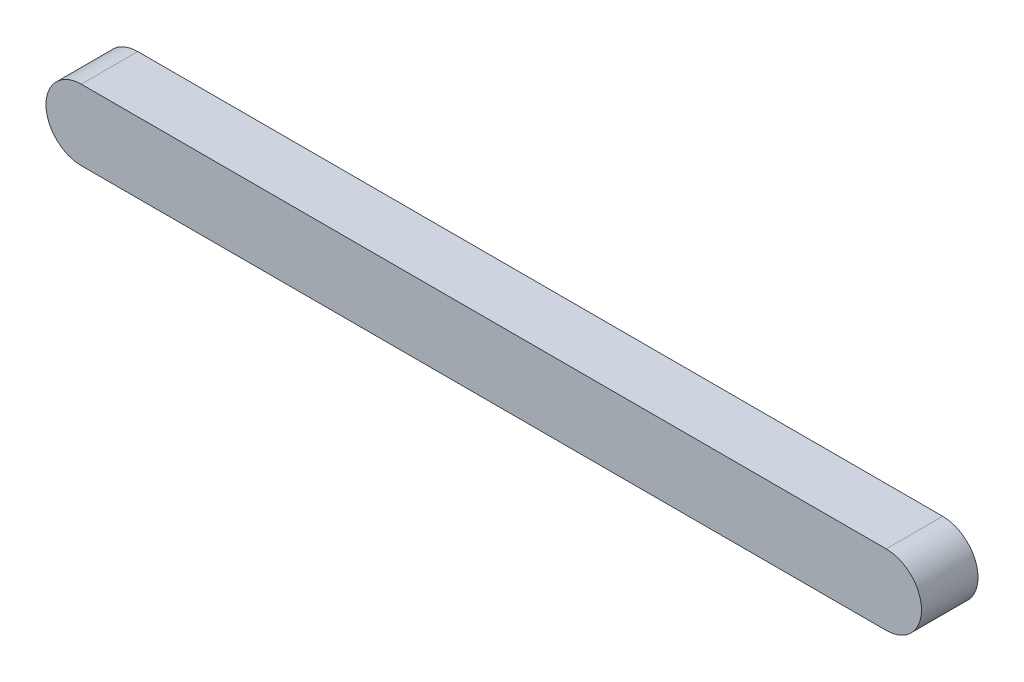
ISO-10303-21;
HEADER;
FILE_DESCRIPTION(('STEP AP214'),'2;1');
FILE_NAME('part.step','',(''),(''),'','','');
FILE_SCHEMA(('AUTOMOTIVE_DESIGN { 1 0 10303 214 1 1 1 1 }'));
ENDSEC;
DATA;
#1=APPLICATION_CONTEXT('core data for automotive mechanical design processes');
#2=APPLICATION_PROTOCOL_DEFINITION('international standard','automotive_design',2000,#1);
#3=PRODUCT_CONTEXT('',#1,'mechanical');
#4=PRODUCT('Part','Part','',(#3));
#5=PRODUCT_RELATED_PRODUCT_CATEGORY('part','',(#4));
#6=PRODUCT_DEFINITION_FORMATION('','',#4);
#7=PRODUCT_DEFINITION_CONTEXT('part definition',#1,'design');
#8=PRODUCT_DEFINITION('design','',#6,#7);
#9=PRODUCT_DEFINITION_SHAPE('','',#8);
#10=(LENGTH_UNIT() NAMED_UNIT(*) SI_UNIT(.MILLI.,.METRE.));
#11=(NAMED_UNIT(*) PLANE_ANGLE_UNIT() SI_UNIT($,.RADIAN.));
#12=(NAMED_UNIT(*) SI_UNIT($,.STERADIAN.) SOLID_ANGLE_UNIT());
#13=UNCERTAINTY_MEASURE_WITH_UNIT(LENGTH_MEASURE(1.E-05),#10,'distance_accuracy_value','');
#14=(GEOMETRIC_REPRESENTATION_CONTEXT(3) GLOBAL_UNCERTAINTY_ASSIGNED_CONTEXT((#13)) GLOBAL_UNIT_ASSIGNED_CONTEXT((#10,
#11,#12)) REPRESENTATION_CONTEXT('',''));
#15=CARTESIAN_POINT('',(0.,0.,0.));
#16=DIRECTION('',(0.,0.,1.));
#17=DIRECTION('',(1.,0.,0.));
#18=AXIS2_PLACEMENT_3D('',#15,#16,#17);
#19=CARTESIAN_POINT('',(0.,0.,8.));
#20=DIRECTION('',(0.,0.,-1.));
#21=DIRECTION('',(-1.,0.,0.));
#22=AXIS2_PLACEMENT_3D('',#19,#20,#21);
#23=CYLINDRICAL_SURFACE('',#22,5.);
#24=CARTESIAN_POINT('',(0.,0.,0.));
#25=DIRECTION('',(0.,0.,1.));
#26=DIRECTION('',(1.,0.,0.));
#27=AXIS2_PLACEMENT_3D('',#24,#25,#26);
#28=CIRCLE('',#27,5.);
#29=CARTESIAN_POINT('',(0.,5.,0.));
#30=VERTEX_POINT('',#29);
#31=CARTESIAN_POINT('',(0.,-5.,0.));
#32=VERTEX_POINT('',#31);
#33=EDGE_CURVE('E111',#30,#32,#28,.T.);
#34=ORIENTED_EDGE('',*,*,#33,.T.);
#35=DIRECTION('',(0.,0.,-1.));
#36=VECTOR('',#35,1.);
#37=CARTESIAN_POINT('',(0.,-5.,8.));
#38=LINE('',#37,#36);
#39=CARTESIAN_POINT('',(0.,-5.,8.));
#40=VERTEX_POINT('',#39);
#41=EDGE_CURVE('E11',#40,#32,#38,.T.);
#42=ORIENTED_EDGE('',*,*,#41,.F.);
#43=CARTESIAN_POINT('',(0.,0.,8.));
#44=DIRECTION('',(0.,0.,1.));
#45=DIRECTION('',(1.,0.,0.));
#46=AXIS2_PLACEMENT_3D('',#43,#44,#45);
#47=CIRCLE('',#46,5.);
#48=CARTESIAN_POINT('',(0.,5.,8.));
#49=VERTEX_POINT('',#48);
#50=EDGE_CURVE('E95',#49,#40,#47,.T.);
#51=ORIENTED_EDGE('',*,*,#50,.F.);
#52=DIRECTION('',(0.,0.,-1.));
#53=VECTOR('',#52,1.);
#54=CARTESIAN_POINT('',(0.,5.,8.));
#55=LINE('',#54,#53);
#56=EDGE_CURVE('E107',#49,#30,#55,.T.);
#57=ORIENTED_EDGE('',*,*,#56,.T.);
#58=EDGE_LOOP('',(#34,#42,#51,#57));
#59=FACE_BOUND('',#58,.T.);
#60=ADVANCED_FACE('F43',(#59),#23,.T.);
#61=CARTESIAN_POINT('',(0.,-5.,8.));
#62=DIRECTION('',(0.,1.,0.));
#63=DIRECTION('',(0.,0.,1.));
#64=AXIS2_PLACEMENT_3D('',#61,#62,#63);
#65=PLANE('',#64);
#66=DIRECTION('',(1.,0.,0.));
#67=VECTOR('',#66,1.);
#68=CARTESIAN_POINT('',(0.,-5.,0.));
#69=LINE('',#68,#67);
#70=CARTESIAN_POINT('',(114.,-5.,0.));
#71=VERTEX_POINT('',#70);
#72=EDGE_CURVE('E100',#32,#71,#69,.T.);
#73=ORIENTED_EDGE('',*,*,#72,.T.);
#74=DIRECTION('',(0.,0.,-1.));
#75=VECTOR('',#74,1.);
#76=CARTESIAN_POINT('',(114.,-5.,8.));
#77=LINE('',#76,#75);
#78=CARTESIAN_POINT('',(114.,-5.,8.));
#79=VERTEX_POINT('',#78);
#80=EDGE_CURVE('E52',#79,#71,#77,.T.);
#81=ORIENTED_EDGE('',*,*,#80,.F.);
#82=DIRECTION('',(1.,0.,0.));
#83=VECTOR('',#82,1.);
#84=CARTESIAN_POINT('',(0.,-5.,8.));
#85=LINE('',#84,#83);
#86=EDGE_CURVE('E90',#40,#79,#85,.T.);
#87=ORIENTED_EDGE('',*,*,#86,.F.);
#88=ORIENTED_EDGE('',*,*,#41,.T.);
#89=EDGE_LOOP('',(#73,#81,#87,#88));
#90=FACE_BOUND('',#89,.T.);
#91=ADVANCED_FACE('F99',(#90),#65,.F.);
#92=CARTESIAN_POINT('',(114.,0.,8.));
#93=DIRECTION('',(0.,0.,-1.));
#94=DIRECTION('',(-1.,0.,0.));
#95=AXIS2_PLACEMENT_3D('',#92,#93,#94);
#96=CYLINDRICAL_SURFACE('',#95,5.);
#97=CARTESIAN_POINT('',(114.,0.,0.));
#98=DIRECTION('',(0.,0.,1.));
#99=DIRECTION('',(1.,0.,0.));
#100=AXIS2_PLACEMENT_3D('',#97,#98,#99);
#101=CIRCLE('',#100,5.);
#102=CARTESIAN_POINT('',(114.,5.,0.));
#103=VERTEX_POINT('',#102);
#104=EDGE_CURVE('E77',#71,#103,#101,.T.);
#105=ORIENTED_EDGE('',*,*,#104,.T.);
#106=DIRECTION('',(0.,0.,-1.));
#107=VECTOR('',#106,1.);
#108=CARTESIAN_POINT('',(114.,5.,8.));
#109=LINE('',#108,#107);
#110=CARTESIAN_POINT('',(114.,5.,8.));
#111=VERTEX_POINT('',#110);
#112=EDGE_CURVE('E102',#111,#103,#109,.T.);
#113=ORIENTED_EDGE('',*,*,#112,.F.);
#114=CARTESIAN_POINT('',(114.,0.,8.));
#115=DIRECTION('',(0.,0.,1.));
#116=DIRECTION('',(1.,0.,0.));
#117=AXIS2_PLACEMENT_3D('',#114,#115,#116);
#118=CIRCLE('',#117,5.);
#119=EDGE_CURVE('E93',#79,#111,#118,.T.);
#120=ORIENTED_EDGE('',*,*,#119,.F.);
#121=ORIENTED_EDGE('',*,*,#80,.T.);
#122=EDGE_LOOP('',(#105,#113,#120,#121));
#123=FACE_BOUND('',#122,.T.);
#124=ADVANCED_FACE('F103',(#123),#96,.T.);
#125=CARTESIAN_POINT('',(0.,5.,8.));
#126=DIRECTION('',(0.,-1.,0.));
#127=DIRECTION('',(0.,0.,-1.));
#128=AXIS2_PLACEMENT_3D('',#125,#126,#127);
#129=PLANE('',#128);
#130=DIRECTION('',(-1.,0.,0.));
#131=VECTOR('',#130,1.);
#132=CARTESIAN_POINT('',(0.,5.,0.));
#133=LINE('',#132,#131);
#134=EDGE_CURVE('E83',#103,#30,#133,.T.);
#135=ORIENTED_EDGE('',*,*,#134,.T.);
#136=ORIENTED_EDGE('',*,*,#56,.F.);
#137=DIRECTION('',(-1.,0.,0.));
#138=VECTOR('',#137,1.);
#139=CARTESIAN_POINT('',(0.,5.,8.));
#140=LINE('',#139,#138);
#141=EDGE_CURVE('E60',#111,#49,#140,.T.);
#142=ORIENTED_EDGE('',*,*,#141,.F.);
#143=ORIENTED_EDGE('',*,*,#112,.T.);
#144=EDGE_LOOP('',(#135,#136,#142,#143));
#145=FACE_BOUND('',#144,.T.);
#146=ADVANCED_FACE('F124',(#145),#129,.F.);
#147=CARTESIAN_POINT('',(0.,0.,8.));
#148=DIRECTION('',(0.,0.,1.));
#149=DIRECTION('',(1.,0.,0.));
#150=AXIS2_PLACEMENT_3D('',#147,#148,#149);
#151=PLANE('',#150);
#152=ORIENTED_EDGE('',*,*,#50,.T.);
#153=ORIENTED_EDGE('',*,*,#86,.T.);
#154=ORIENTED_EDGE('',*,*,#119,.T.);
#155=ORIENTED_EDGE('',*,*,#141,.T.);
#156=EDGE_LOOP('',(#152,#153,#154,#155));
#157=FACE_BOUND('',#156,.T.);
#158=ADVANCED_FACE('F91',(#157),#151,.T.);
#159=CARTESIAN_POINT('',(0.,0.,0.));
#160=DIRECTION('',(0.,0.,1.));
#161=DIRECTION('',(1.,0.,0.));
#162=AXIS2_PLACEMENT_3D('',#159,#160,#161);
#163=PLANE('',#162);
#164=ORIENTED_EDGE('',*,*,#33,.F.);
#165=ORIENTED_EDGE('',*,*,#134,.F.);
#166=ORIENTED_EDGE('',*,*,#104,.F.);
#167=ORIENTED_EDGE('',*,*,#72,.F.);
#168=EDGE_LOOP('',(#164,#165,#166,#167));
#169=FACE_BOUND('',#168,.T.);
#170=ADVANCED_FACE('F127',(#169),#163,.F.);
#171=CLOSED_SHELL('',(#60,#91,#124,#146,#158,#170));
#172=MANIFOLD_SOLID_BREP('B2',#171);
#173=ADVANCED_BREP_SHAPE_REPRESENTATION('',(#18,#172),#14);
#174=SHAPE_DEFINITION_REPRESENTATION(#9,#173);
ENDSEC;
END-ISO-10303-21;
